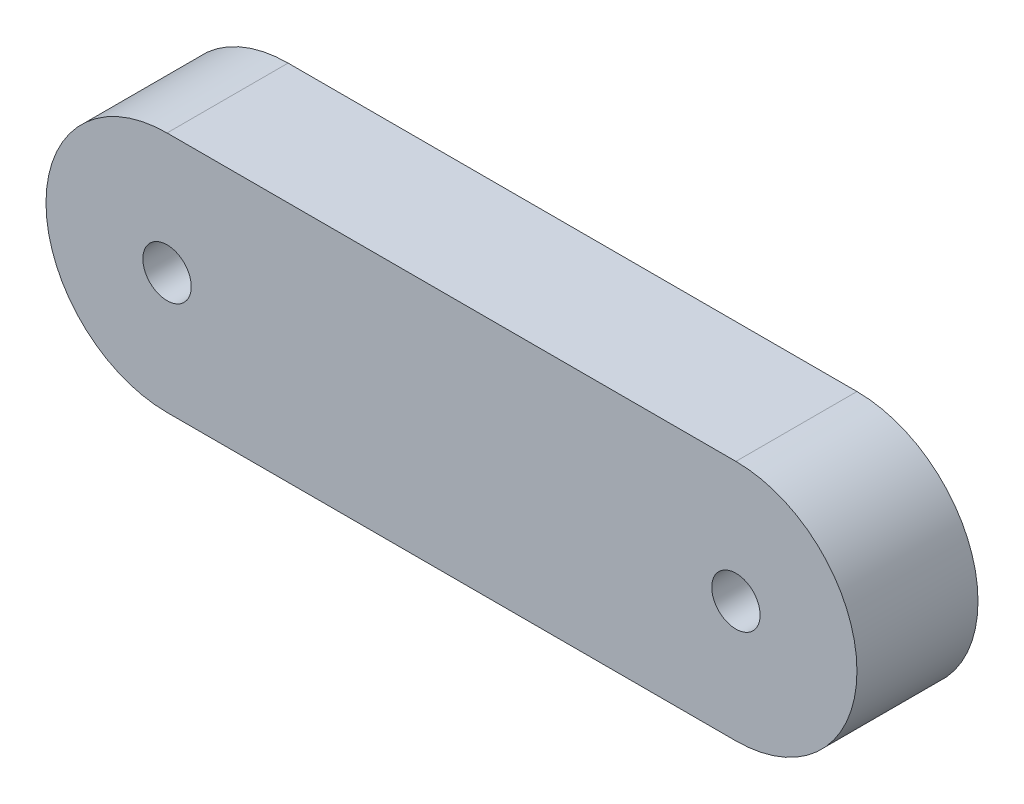
ISO-10303-21;
HEADER;
FILE_DESCRIPTION(('STEP AP214'),'2;1');
FILE_NAME('part.step','',(''),(''),'','','');
FILE_SCHEMA(('AUTOMOTIVE_DESIGN { 1 0 10303 214 1 1 1 1 }'));
ENDSEC;
DATA;
#1=APPLICATION_CONTEXT('core data for automotive mechanical design processes');
#2=APPLICATION_PROTOCOL_DEFINITION('international standard','automotive_design',2000,#1);
#3=PRODUCT_CONTEXT('',#1,'mechanical');
#4=PRODUCT('Part','Part','',(#3));
#5=PRODUCT_RELATED_PRODUCT_CATEGORY('part','',(#4));
#6=PRODUCT_DEFINITION_FORMATION('','',#4);
#7=PRODUCT_DEFINITION_CONTEXT('part definition',#1,'design');
#8=PRODUCT_DEFINITION('design','',#6,#7);
#9=PRODUCT_DEFINITION_SHAPE('','',#8);
#10=(LENGTH_UNIT() NAMED_UNIT(*) SI_UNIT(.MILLI.,.METRE.));
#11=(NAMED_UNIT(*) PLANE_ANGLE_UNIT() SI_UNIT($,.RADIAN.));
#12=(NAMED_UNIT(*) SI_UNIT($,.STERADIAN.) SOLID_ANGLE_UNIT());
#13=UNCERTAINTY_MEASURE_WITH_UNIT(LENGTH_MEASURE(1.E-05),#10,'distance_accuracy_value','');
#14=(GEOMETRIC_REPRESENTATION_CONTEXT(3) GLOBAL_UNCERTAINTY_ASSIGNED_CONTEXT((#13)) GLOBAL_UNIT_ASSIGNED_CONTEXT((#10,
#11,#12)) REPRESENTATION_CONTEXT('',''));
#15=CARTESIAN_POINT('',(0.,0.,0.));
#16=DIRECTION('',(0.,0.,1.));
#17=DIRECTION('',(1.,0.,0.));
#18=AXIS2_PLACEMENT_3D('',#15,#16,#17);
#19=CARTESIAN_POINT('',(-146.23283082077,7.50418760469009,10.));
#20=DIRECTION('',(0.,0.,1.));
#21=DIRECTION('',(1.,0.,0.));
#22=AXIS2_PLACEMENT_3D('',#19,#20,#21);
#23=PLANE('',#22);
#24=CARTESIAN_POINT('',(-193.23283082077,7.50418760469013,10.));
#25=DIRECTION('',(0.,0.,1.));
#26=DIRECTION('',(1.,0.,0.));
#27=AXIS2_PLACEMENT_3D('',#24,#25,#26);
#28=CIRCLE('',#27,2.);
#29=CARTESIAN_POINT('',(-191.23283082077,7.50418760469013,10.));
#30=VERTEX_POINT('',#29);
#31=EDGE_CURVE('E102',#30,#30,#28,.T.);
#32=ORIENTED_EDGE('',*,*,#31,.F.);
#33=EDGE_LOOP('',(#32));
#34=FACE_BOUND('',#33,.T.);
#35=CARTESIAN_POINT('',(-146.23283082077,7.50418760469009,10.));
#36=DIRECTION('',(0.,0.,1.));
#37=DIRECTION('',(1.,0.,0.));
#38=AXIS2_PLACEMENT_3D('',#35,#36,#37);
#39=CIRCLE('',#38,10.);
#40=CARTESIAN_POINT('',(-146.23283082077,-2.49581239530991,10.));
#41=VERTEX_POINT('',#40);
#42=CARTESIAN_POINT('',(-146.23283082077,17.5041876046901,10.));
#43=VERTEX_POINT('',#42);
#44=EDGE_CURVE('E87',#41,#43,#39,.T.);
#45=ORIENTED_EDGE('',*,*,#44,.T.);
#46=DIRECTION('',(-1.,0.,0.));
#47=VECTOR('',#46,1.);
#48=CARTESIAN_POINT('',(-146.23283082077,17.5041876046901,10.));
#49=LINE('',#48,#47);
#50=CARTESIAN_POINT('',(-193.23283082077,17.5041876046901,10.));
#51=VERTEX_POINT('',#50);
#52=EDGE_CURVE('E82',#43,#51,#49,.T.);
#53=ORIENTED_EDGE('',*,*,#52,.T.);
#54=CARTESIAN_POINT('',(-193.23283082077,7.50418760469013,10.));
#55=DIRECTION('',(0.,0.,1.));
#56=DIRECTION('',(1.,0.,0.));
#57=AXIS2_PLACEMENT_3D('',#54,#55,#56);
#58=CIRCLE('',#57,10.);
#59=CARTESIAN_POINT('',(-193.23283082077,-2.49581239530991,10.));
#60=VERTEX_POINT('',#59);
#61=EDGE_CURVE('E85',#51,#60,#58,.T.);
#62=ORIENTED_EDGE('',*,*,#61,.T.);
#63=DIRECTION('',(1.,0.,0.));
#64=VECTOR('',#63,1.);
#65=CARTESIAN_POINT('',(-146.23283082077,-2.49581239530991,10.));
#66=LINE('',#65,#64);
#67=EDGE_CURVE('E52',#60,#41,#66,.T.);
#68=ORIENTED_EDGE('',*,*,#67,.T.);
#69=EDGE_LOOP('',(#45,#53,#62,#68));
#70=FACE_BOUND('',#69,.T.);
#71=CARTESIAN_POINT('',(-146.23283082077,7.50418760469009,10.));
#72=DIRECTION('',(0.,0.,1.));
#73=DIRECTION('',(1.,0.,0.));
#74=AXIS2_PLACEMENT_3D('',#71,#72,#73);
#75=CIRCLE('',#74,2.);
#76=CARTESIAN_POINT('',(-144.23283082077,7.50418760469009,10.));
#77=VERTEX_POINT('',#76);
#78=EDGE_CURVE('E117',#77,#77,#75,.T.);
#79=ORIENTED_EDGE('',*,*,#78,.F.);
#80=EDGE_LOOP('',(#79));
#81=FACE_BOUND('',#80,.T.);
#82=ADVANCED_FACE('F35',(#34,#70,#81),#23,.T.);
#83=CARTESIAN_POINT('',(-146.23283082077,7.50418760469009,0.));
#84=DIRECTION('',(0.,0.,1.));
#85=DIRECTION('',(1.,0.,0.));
#86=AXIS2_PLACEMENT_3D('',#83,#84,#85);
#87=PLANE('',#86);
#88=CARTESIAN_POINT('',(-146.23283082077,7.50418760469009,0.));
#89=DIRECTION('',(0.,0.,1.));
#90=DIRECTION('',(1.,0.,0.));
#91=AXIS2_PLACEMENT_3D('',#88,#89,#90);
#92=CIRCLE('',#91,10.);
#93=CARTESIAN_POINT('',(-146.23283082077,-2.49581239530991,0.));
#94=VERTEX_POINT('',#93);
#95=CARTESIAN_POINT('',(-146.23283082077,17.5041876046901,0.));
#96=VERTEX_POINT('',#95);
#97=EDGE_CURVE('E99',#94,#96,#92,.T.);
#98=ORIENTED_EDGE('',*,*,#97,.F.);
#99=DIRECTION('',(1.,0.,0.));
#100=VECTOR('',#99,1.);
#101=CARTESIAN_POINT('',(-146.23283082077,-2.49581239530991,0.));
#102=LINE('',#101,#100);
#103=CARTESIAN_POINT('',(-193.23283082077,-2.49581239530991,0.));
#104=VERTEX_POINT('',#103);
#105=EDGE_CURVE('E75',#104,#94,#102,.T.);
#106=ORIENTED_EDGE('',*,*,#105,.F.);
#107=CARTESIAN_POINT('',(-193.23283082077,7.50418760469013,0.));
#108=DIRECTION('',(0.,0.,1.));
#109=DIRECTION('',(1.,0.,0.));
#110=AXIS2_PLACEMENT_3D('',#107,#108,#109);
#111=CIRCLE('',#110,10.);
#112=CARTESIAN_POINT('',(-193.23283082077,17.5041876046901,0.));
#113=VERTEX_POINT('',#112);
#114=EDGE_CURVE('E69',#113,#104,#111,.T.);
#115=ORIENTED_EDGE('',*,*,#114,.F.);
#116=DIRECTION('',(-1.,0.,0.));
#117=VECTOR('',#116,1.);
#118=CARTESIAN_POINT('',(-146.23283082077,17.5041876046901,0.));
#119=LINE('',#118,#117);
#120=EDGE_CURVE('E91',#96,#113,#119,.T.);
#121=ORIENTED_EDGE('',*,*,#120,.F.);
#122=EDGE_LOOP('',(#98,#106,#115,#121));
#123=FACE_BOUND('',#122,.T.);
#124=CARTESIAN_POINT('',(-193.23283082077,7.50418760469013,0.));
#125=DIRECTION('',(0.,0.,1.));
#126=DIRECTION('',(1.,0.,0.));
#127=AXIS2_PLACEMENT_3D('',#124,#125,#126);
#128=CIRCLE('',#127,2.);
#129=CARTESIAN_POINT('',(-191.23283082077,7.50418760469013,0.));
#130=VERTEX_POINT('',#129);
#131=EDGE_CURVE('E114',#130,#130,#128,.T.);
#132=ORIENTED_EDGE('',*,*,#131,.T.);
#133=EDGE_LOOP('',(#132));
#134=FACE_BOUND('',#133,.T.);
#135=CARTESIAN_POINT('',(-146.23283082077,7.50418760469009,0.));
#136=DIRECTION('',(0.,0.,1.));
#137=DIRECTION('',(1.,0.,0.));
#138=AXIS2_PLACEMENT_3D('',#135,#136,#137);
#139=CIRCLE('',#138,2.);
#140=CARTESIAN_POINT('',(-144.23283082077,7.50418760469009,0.));
#141=VERTEX_POINT('',#140);
#142=EDGE_CURVE('E120',#141,#141,#139,.T.);
#143=ORIENTED_EDGE('',*,*,#142,.T.);
#144=EDGE_LOOP('',(#143));
#145=FACE_BOUND('',#144,.T.);
#146=ADVANCED_FACE('F110',(#123,#134,#145),#87,.F.);
#147=CARTESIAN_POINT('',(-146.23283082077,7.50418760469009,10.));
#148=DIRECTION('',(0.,0.,-1.));
#149=DIRECTION('',(-1.,0.,0.));
#150=AXIS2_PLACEMENT_3D('',#147,#148,#149);
#151=CYLINDRICAL_SURFACE('',#150,10.);
#152=ORIENTED_EDGE('',*,*,#97,.T.);
#153=DIRECTION('',(0.,0.,-1.));
#154=VECTOR('',#153,1.);
#155=CARTESIAN_POINT('',(-146.23283082077,17.5041876046901,10.));
#156=LINE('',#155,#154);
#157=EDGE_CURVE('E11',#43,#96,#156,.T.);
#158=ORIENTED_EDGE('',*,*,#157,.F.);
#159=ORIENTED_EDGE('',*,*,#44,.F.);
#160=DIRECTION('',(0.,0.,-1.));
#161=VECTOR('',#160,1.);
#162=CARTESIAN_POINT('',(-146.23283082077,-2.49581239530991,10.));
#163=LINE('',#162,#161);
#164=EDGE_CURVE('E95',#41,#94,#163,.T.);
#165=ORIENTED_EDGE('',*,*,#164,.T.);
#166=EDGE_LOOP('',(#152,#158,#159,#165));
#167=FACE_BOUND('',#166,.T.);
#168=ADVANCED_FACE('F37',(#167),#151,.T.);
#169=CARTESIAN_POINT('',(-146.23283082077,17.5041876046901,10.));
#170=DIRECTION('',(0.,-1.,0.));
#171=DIRECTION('',(1.,0.,0.));
#172=AXIS2_PLACEMENT_3D('',#169,#170,#171);
#173=PLANE('',#172);
#174=ORIENTED_EDGE('',*,*,#120,.T.);
#175=DIRECTION('',(0.,0.,-1.));
#176=VECTOR('',#175,1.);
#177=CARTESIAN_POINT('',(-193.23283082077,17.5041876046901,10.));
#178=LINE('',#177,#176);
#179=EDGE_CURVE('E44',#51,#113,#178,.T.);
#180=ORIENTED_EDGE('',*,*,#179,.F.);
#181=ORIENTED_EDGE('',*,*,#52,.F.);
#182=ORIENTED_EDGE('',*,*,#157,.T.);
#183=EDGE_LOOP('',(#174,#180,#181,#182));
#184=FACE_BOUND('',#183,.T.);
#185=ADVANCED_FACE('F90',(#184),#173,.F.);
#186=CARTESIAN_POINT('',(-193.23283082077,7.50418760469013,10.));
#187=DIRECTION('',(0.,0.,-1.));
#188=DIRECTION('',(-1.,0.,0.));
#189=AXIS2_PLACEMENT_3D('',#186,#187,#188);
#190=CYLINDRICAL_SURFACE('',#189,10.);
#191=ORIENTED_EDGE('',*,*,#114,.T.);
#192=DIRECTION('',(0.,0.,-1.));
#193=VECTOR('',#192,1.);
#194=CARTESIAN_POINT('',(-193.23283082077,-2.49581239530991,10.));
#195=LINE('',#194,#193);
#196=EDGE_CURVE('E92',#60,#104,#195,.T.);
#197=ORIENTED_EDGE('',*,*,#196,.F.);
#198=ORIENTED_EDGE('',*,*,#61,.F.);
#199=ORIENTED_EDGE('',*,*,#179,.T.);
#200=EDGE_LOOP('',(#191,#197,#198,#199));
#201=FACE_BOUND('',#200,.T.);
#202=ADVANCED_FACE('F93',(#201),#190,.T.);
#203=CARTESIAN_POINT('',(-146.23283082077,-2.49581239530991,10.));
#204=DIRECTION('',(0.,1.,0.));
#205=DIRECTION('',(-1.,0.,0.));
#206=AXIS2_PLACEMENT_3D('',#203,#204,#205);
#207=PLANE('',#206);
#208=ORIENTED_EDGE('',*,*,#105,.T.);
#209=ORIENTED_EDGE('',*,*,#164,.F.);
#210=ORIENTED_EDGE('',*,*,#67,.F.);
#211=ORIENTED_EDGE('',*,*,#196,.T.);
#212=EDGE_LOOP('',(#208,#209,#210,#211));
#213=FACE_BOUND('',#212,.T.);
#214=ADVANCED_FACE('F107',(#213),#207,.F.);
#215=CARTESIAN_POINT('',(-193.23283082077,7.50418760469013,10.));
#216=DIRECTION('',(0.,0.,-1.));
#217=DIRECTION('',(-1.,0.,0.));
#218=AXIS2_PLACEMENT_3D('',#215,#216,#217);
#219=CYLINDRICAL_SURFACE('',#218,2.);
#220=ORIENTED_EDGE('',*,*,#31,.T.);
#221=EDGE_LOOP('',(#220));
#222=FACE_BOUND('',#221,.T.);
#223=ORIENTED_EDGE('',*,*,#131,.F.);
#224=EDGE_LOOP('',(#223));
#225=FACE_BOUND('',#224,.T.);
#226=ADVANCED_FACE('F137',(#222,#225),#219,.F.);
#227=CARTESIAN_POINT('',(-146.23283082077,7.50418760469009,10.));
#228=DIRECTION('',(0.,0.,-1.));
#229=DIRECTION('',(-1.,0.,0.));
#230=AXIS2_PLACEMENT_3D('',#227,#228,#229);
#231=CYLINDRICAL_SURFACE('',#230,2.);
#232=ORIENTED_EDGE('',*,*,#78,.T.);
#233=EDGE_LOOP('',(#232));
#234=FACE_BOUND('',#233,.T.);
#235=ORIENTED_EDGE('',*,*,#142,.F.);
#236=EDGE_LOOP('',(#235));
#237=FACE_BOUND('',#236,.T.);
#238=ADVANCED_FACE('F126',(#234,#237),#231,.F.);
#239=CLOSED_SHELL('',(#82,#146,#168,#185,#202,#214,#226,#238));
#240=MANIFOLD_SOLID_BREP('B2',#239);
#241=ADVANCED_BREP_SHAPE_REPRESENTATION('',(#18,#240),#14);
#242=SHAPE_DEFINITION_REPRESENTATION(#9,#241);
ENDSEC;
END-ISO-10303-21;
